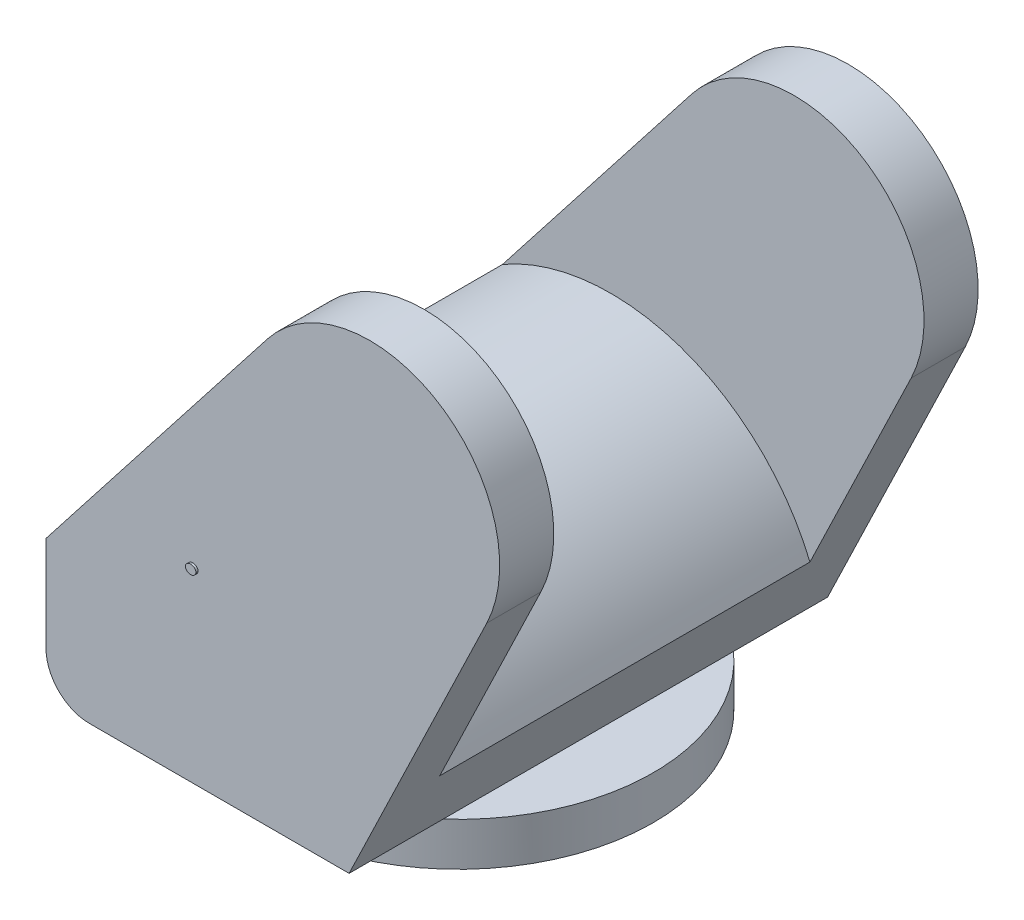
ISO-10303-21;
HEADER;
FILE_DESCRIPTION(('STEP AP214'),'2;1');
FILE_NAME('part.step','',(''),(''),'','','');
FILE_SCHEMA(('AUTOMOTIVE_DESIGN { 1 0 10303 214 1 1 1 1 }'));
ENDSEC;
DATA;
#1=APPLICATION_CONTEXT('core data for automotive mechanical design processes');
#2=APPLICATION_PROTOCOL_DEFINITION('international standard','automotive_design',2000,#1);
#3=PRODUCT_CONTEXT('',#1,'mechanical');
#4=PRODUCT('Part','Part','',(#3));
#5=PRODUCT_RELATED_PRODUCT_CATEGORY('part','',(#4));
#6=PRODUCT_DEFINITION_FORMATION('','',#4);
#7=PRODUCT_DEFINITION_CONTEXT('part definition',#1,'design');
#8=PRODUCT_DEFINITION('design','',#6,#7);
#9=PRODUCT_DEFINITION_SHAPE('','',#8);
#10=(LENGTH_UNIT() NAMED_UNIT(*) SI_UNIT(.MILLI.,.METRE.));
#11=(NAMED_UNIT(*) PLANE_ANGLE_UNIT() SI_UNIT($,.RADIAN.));
#12=(NAMED_UNIT(*) SI_UNIT($,.STERADIAN.) SOLID_ANGLE_UNIT());
#13=UNCERTAINTY_MEASURE_WITH_UNIT(LENGTH_MEASURE(1.E-05),#10,'distance_accuracy_value','');
#14=(GEOMETRIC_REPRESENTATION_CONTEXT(3) GLOBAL_UNCERTAINTY_ASSIGNED_CONTEXT((#13)) GLOBAL_UNIT_ASSIGNED_CONTEXT((#10,
#11,#12)) REPRESENTATION_CONTEXT('',''));
#15=CARTESIAN_POINT('',(0.,0.,0.));
#16=DIRECTION('',(0.,0.,1.));
#17=DIRECTION('',(1.,0.,0.));
#18=AXIS2_PLACEMENT_3D('',#15,#16,#17);
#19=CARTESIAN_POINT('',(-9.54614839573771,-157.96,110.5));
#20=DIRECTION('',(0.,-1.,0.));
#21=DIRECTION('',(-1.,0.,0.));
#22=AXIS2_PLACEMENT_3D('',#19,#20,#21);
#23=PLANE('',#22);
#24=DIRECTION('',(0.,0.,-1.));
#25=VECTOR('',#24,1.);
#26=CARTESIAN_POINT('',(-129.546148395738,-157.96,110.5));
#27=LINE('',#26,#25);
#28=CARTESIAN_POINT('',(-129.546148395738,-157.96,110.5));
#29=VERTEX_POINT('',#28);
#30=CARTESIAN_POINT('',(-129.546148395738,-157.96,67.0820393249939));
#31=VERTEX_POINT('',#30);
#32=EDGE_CURVE('E257',#29,#31,#27,.T.);
#33=ORIENTED_EDGE('',*,*,#32,.T.);
#34=CARTESIAN_POINT('',(-69.5461483957381,-157.96,0.));
#35=DIRECTION('',(0.,-1.,0.));
#36=DIRECTION('',(-1.,0.,0.));
#37=AXIS2_PLACEMENT_3D('',#34,#35,#36);
#38=CIRCLE('',#37,90.);
#39=CARTESIAN_POINT('',(-9.54614839573785,-157.96,67.0820393249935));
#40=VERTEX_POINT('',#39);
#41=EDGE_CURVE('E11',#31,#40,#38,.F.);
#42=ORIENTED_EDGE('',*,*,#41,.T.);
#43=DIRECTION('',(0.,0.,-1.));
#44=VECTOR('',#43,1.);
#45=CARTESIAN_POINT('',(-9.54614839573771,-157.96,110.5));
#46=LINE('',#45,#44);
#47=CARTESIAN_POINT('',(-9.54614839573771,-157.96,110.5));
#48=VERTEX_POINT('',#47);
#49=EDGE_CURVE('E270',#48,#40,#46,.T.);
#50=ORIENTED_EDGE('',*,*,#49,.F.);
#51=DIRECTION('',(-1.,0.,0.));
#52=VECTOR('',#51,1.);
#53=CARTESIAN_POINT('',(-9.54614839573771,-157.96,110.5));
#54=LINE('',#53,#52);
#55=EDGE_CURVE('E260',#48,#29,#54,.T.);
#56=ORIENTED_EDGE('',*,*,#55,.T.);
#57=EDGE_LOOP('',(#33,#42,#50,#56));
#58=FACE_BOUND('',#57,.T.);
#59=ADVANCED_FACE('F35',(#58),#23,.T.);
#60=CARTESIAN_POINT('',(0.,0.,110.5));
#61=DIRECTION('',(0.,0.,-1.));
#62=DIRECTION('',(-1.,0.,0.));
#63=AXIS2_PLACEMENT_3D('',#60,#61,#62);
#64=CYLINDRICAL_SURFACE('',#63,60.);
#65=DIRECTION('',(0.,0.,-1.));
#66=VECTOR('',#65,1.);
#67=CARTESIAN_POINT('',(54.0466596870904,-26.0568335886737,110.5));
#68=LINE('',#67,#66);
#69=CARTESIAN_POINT('',(54.0466596870904,-26.0568335886737,110.5));
#70=VERTEX_POINT('',#69);
#71=CARTESIAN_POINT('',(54.0466596870904,-26.0568335886737,85.4999999999996));
#72=VERTEX_POINT('',#71);
#73=EDGE_CURVE('E43',#70,#72,#68,.T.);
#74=ORIENTED_EDGE('',*,*,#73,.T.);
#75=CARTESIAN_POINT('',(0.,0.,85.4999999999997));
#76=DIRECTION('',(0.,0.,-1.));
#77=DIRECTION('',(-1.,0.,0.));
#78=AXIS2_PLACEMENT_3D('',#75,#76,#77);
#79=CIRCLE('',#78,60.);
#80=CARTESIAN_POINT('',(-47.2814411313745,36.9386697722099,85.4999999999999));
#81=VERTEX_POINT('',#80);
#82=EDGE_CURVE('E356',#81,#72,#79,.T.);
#83=ORIENTED_EDGE('',*,*,#82,.F.);
#84=DIRECTION('',(0.,0.,-1.));
#85=VECTOR('',#84,1.);
#86=CARTESIAN_POINT('',(-47.2814411313744,36.9386697722099,110.5));
#87=LINE('',#86,#85);
#88=CARTESIAN_POINT('',(-47.2814411313744,36.9386697722099,110.5));
#89=VERTEX_POINT('',#88);
#90=EDGE_CURVE('E294',#89,#81,#87,.T.);
#91=ORIENTED_EDGE('',*,*,#90,.F.);
#92=CARTESIAN_POINT('',(0.,0.,110.5));
#93=DIRECTION('',(0.,0.,-1.));
#94=DIRECTION('',(-1.,0.,0.));
#95=AXIS2_PLACEMENT_3D('',#92,#93,#94);
#96=CIRCLE('',#95,60.);
#97=EDGE_CURVE('E280',#89,#70,#96,.T.);
#98=ORIENTED_EDGE('',*,*,#97,.T.);
#99=EDGE_LOOP('',(#74,#83,#91,#98));
#100=FACE_BOUND('',#99,.T.);
#101=ADVANCED_FACE('F233',(#100),#64,.T.);
#102=CARTESIAN_POINT('',(-9.54614839573771,-157.96,110.5));
#103=DIRECTION('',(0.900777661451507,-0.434280559811229,0.));
#104=DIRECTION('',(-0.434280559811229,-0.900777661451507,0.));
#105=AXIS2_PLACEMENT_3D('',#102,#103,#104);
#106=PLANE('',#105);
#107=DIRECTION('',(-0.434280559811229,-0.900777661451507,0.));
#108=VECTOR('',#107,1.);
#109=CARTESIAN_POINT('',(54.0466596870897,-26.0568335886737,-85.5000000000005));
#110=LINE('',#109,#108);
#111=CARTESIAN_POINT('',(54.0466596870897,-26.0568335886737,-85.5000000000005));
#112=VERTEX_POINT('',#111);
#113=CARTESIAN_POINT('',(7.31079646171123,-122.99559962594,-85.5000000000003));
#114=VERTEX_POINT('',#113);
#115=EDGE_CURVE('E345',#112,#114,#110,.T.);
#116=ORIENTED_EDGE('',*,*,#115,.T.);
#117=DIRECTION('',(0.,0.,1.));
#118=VECTOR('',#117,1.);
#119=CARTESIAN_POINT('',(7.31079646171123,-122.99559962594,-85.5000000000003));
#120=LINE('',#119,#118);
#121=CARTESIAN_POINT('',(7.31079646171184,-122.99559962594,85.4999999999997));
#122=VERTEX_POINT('',#121);
#123=EDGE_CURVE('E336',#114,#122,#120,.T.);
#124=ORIENTED_EDGE('',*,*,#123,.T.);
#125=DIRECTION('',(-0.434280559811229,-0.900777661451507,0.));
#126=VECTOR('',#125,1.);
#127=CARTESIAN_POINT('',(54.0466596870904,-26.0568335886737,85.4999999999996));
#128=LINE('',#127,#126);
#129=EDGE_CURVE('E353',#72,#122,#128,.T.);
#130=ORIENTED_EDGE('',*,*,#129,.F.);
#131=ORIENTED_EDGE('',*,*,#73,.F.);
#132=DIRECTION('',(-0.434280559811229,-0.900777661451507,0.));
#133=VECTOR('',#132,1.);
#134=CARTESIAN_POINT('',(-9.54614839573771,-157.96,110.5));
#135=LINE('',#134,#133);
#136=EDGE_CURVE('E317',#70,#48,#135,.T.);
#137=ORIENTED_EDGE('',*,*,#136,.T.);
#138=ORIENTED_EDGE('',*,*,#49,.T.);
#139=CARTESIAN_POINT('',(-9.54614839573832,-157.96,-67.0820393249939));
#140=VERTEX_POINT('',#139);
#141=EDGE_CURVE('E275',#40,#140,#46,.T.);
#142=ORIENTED_EDGE('',*,*,#141,.T.);
#143=CARTESIAN_POINT('',(-9.54614839573849,-157.96,-110.5));
#144=VERTEX_POINT('',#143);
#145=EDGE_CURVE('E276',#140,#144,#46,.T.);
#146=ORIENTED_EDGE('',*,*,#145,.T.);
#147=DIRECTION('',(-0.434280559811229,-0.900777661451507,0.));
#148=VECTOR('',#147,1.);
#149=CARTESIAN_POINT('',(-9.54614839573849,-157.96,-110.5));
#150=LINE('',#149,#148);
#151=CARTESIAN_POINT('',(54.0466596870897,-26.0568335886737,-110.5));
#152=VERTEX_POINT('',#151);
#153=EDGE_CURVE('E334',#152,#144,#150,.T.);
#154=ORIENTED_EDGE('',*,*,#153,.F.);
#155=EDGE_CURVE('E293',#112,#152,#68,.T.);
#156=ORIENTED_EDGE('',*,*,#155,.F.);
#157=EDGE_LOOP('',(#116,#124,#130,#131,#137,#138,#142,#146,#154,#156));
#158=FACE_BOUND('',#157,.T.);
#159=ADVANCED_FACE('F37',(#158),#106,.T.);
#160=CARTESIAN_POINT('',(-6.93889390390723E-13,0.,-85.5000000000003));
#161=DIRECTION('',(0.,0.,-1.));
#162=DIRECTION('',(-1.,0.,0.));
#163=AXIS2_PLACEMENT_3D('',#160,#161,#162);
#164=CIRCLE('',#163,60.);
#165=CARTESIAN_POINT('',(-47.2814411313751,36.9386697722099,-85.5000000000001));
#166=VERTEX_POINT('',#165);
#167=EDGE_CURVE('E348',#166,#112,#164,.T.);
#168=ORIENTED_EDGE('',*,*,#167,.T.);
#169=ORIENTED_EDGE('',*,*,#155,.T.);
#170=CARTESIAN_POINT('',(-7.7715611723761E-13,0.,-110.5));
#171=DIRECTION('',(0.,0.,-1.));
#172=DIRECTION('',(-1.,0.,0.));
#173=AXIS2_PLACEMENT_3D('',#170,#171,#172);
#174=CIRCLE('',#173,60.);
#175=CARTESIAN_POINT('',(-47.2814411313752,36.9386697722099,-110.5));
#176=VERTEX_POINT('',#175);
#177=EDGE_CURVE('E312',#176,#152,#174,.T.);
#178=ORIENTED_EDGE('',*,*,#177,.F.);
#179=EDGE_CURVE('E297',#166,#176,#87,.T.);
#180=ORIENTED_EDGE('',*,*,#179,.F.);
#181=EDGE_LOOP('',(#168,#169,#178,#180));
#182=FACE_BOUND('',#181,.T.);
#183=ADVANCED_FACE('F228',(#182),#64,.T.);
#184=CARTESIAN_POINT('',(-149.546148395738,-93.96,110.5));
#185=DIRECTION('',(-0.78802401885624,0.6156444962035,0.));
#186=DIRECTION('',(0.6156444962035,0.78802401885624,0.));
#187=AXIS2_PLACEMENT_3D('',#184,#185,#186);
#188=PLANE('',#187);
#189=DIRECTION('',(0.6156444962035,0.78802401885624,0.));
#190=VECTOR('',#189,1.);
#191=CARTESIAN_POINT('',(-134.696631243722,-74.9526406288566,-85.4999999999998));
#192=LINE('',#191,#190);
#193=CARTESIAN_POINT('',(-134.696631243722,-74.9526406288566,-85.4999999999998));
#194=VERTEX_POINT('',#193);
#195=EDGE_CURVE('E307',#194,#166,#192,.T.);
#196=ORIENTED_EDGE('',*,*,#195,.T.);
#197=ORIENTED_EDGE('',*,*,#179,.T.);
#198=DIRECTION('',(0.6156444962035,0.78802401885624,0.));
#199=VECTOR('',#198,1.);
#200=CARTESIAN_POINT('',(-149.546148395738,-93.96,-110.5));
#201=LINE('',#200,#199);
#202=CARTESIAN_POINT('',(-149.546148395738,-93.96,-110.5));
#203=VERTEX_POINT('',#202);
#204=EDGE_CURVE('E305',#203,#176,#201,.T.);
#205=ORIENTED_EDGE('',*,*,#204,.F.);
#206=DIRECTION('',(0.,0.,-1.));
#207=VECTOR('',#206,1.);
#208=CARTESIAN_POINT('',(-149.546148395738,-93.96,110.5));
#209=LINE('',#208,#207);
#210=CARTESIAN_POINT('',(-149.546148395738,-93.96,110.5));
#211=VERTEX_POINT('',#210);
#212=EDGE_CURVE('E268',#211,#203,#209,.T.);
#213=ORIENTED_EDGE('',*,*,#212,.F.);
#214=DIRECTION('',(0.6156444962035,0.78802401885624,0.));
#215=VECTOR('',#214,1.);
#216=CARTESIAN_POINT('',(-149.546148395738,-93.96,110.5));
#217=LINE('',#216,#215);
#218=EDGE_CURVE('E283',#211,#89,#217,.T.);
#219=ORIENTED_EDGE('',*,*,#218,.T.);
#220=ORIENTED_EDGE('',*,*,#90,.T.);
#221=DIRECTION('',(0.6156444962035,0.78802401885624,0.));
#222=VECTOR('',#221,1.);
#223=CARTESIAN_POINT('',(-134.696631243722,-74.9526406288566,85.5000000000002));
#224=LINE('',#223,#222);
#225=CARTESIAN_POINT('',(-134.696631243722,-74.9526406288566,85.5000000000002));
#226=VERTEX_POINT('',#225);
#227=EDGE_CURVE('E358',#226,#81,#224,.T.);
#228=ORIENTED_EDGE('',*,*,#227,.F.);
#229=DIRECTION('',(0.,0.,1.));
#230=VECTOR('',#229,1.);
#231=CARTESIAN_POINT('',(-134.696631243722,-74.9526406288566,-85.4999999999998));
#232=LINE('',#231,#230);
#233=EDGE_CURVE('E339',#194,#226,#232,.T.);
#234=ORIENTED_EDGE('',*,*,#233,.F.);
#235=EDGE_LOOP('',(#196,#197,#205,#213,#219,#220,#228,#234));
#236=FACE_BOUND('',#235,.T.);
#237=ADVANCED_FACE('F231',(#236),#188,.T.);
#238=CARTESIAN_POINT('',(-149.546148395738,-137.96,110.5));
#239=DIRECTION('',(-1.,0.,0.));
#240=DIRECTION('',(0.,0.,1.));
#241=AXIS2_PLACEMENT_3D('',#238,#239,#240);
#242=PLANE('',#241);
#243=ORIENTED_EDGE('',*,*,#212,.T.);
#244=DIRECTION('',(0.,1.,0.));
#245=VECTOR('',#244,1.);
#246=CARTESIAN_POINT('',(-149.546148395738,-137.96,-110.5));
#247=LINE('',#246,#245);
#248=CARTESIAN_POINT('',(-149.546148395738,-137.96,-110.5));
#249=VERTEX_POINT('',#248);
#250=EDGE_CURVE('E314',#249,#203,#247,.T.);
#251=ORIENTED_EDGE('',*,*,#250,.F.);
#252=DIRECTION('',(0.,0.,-1.));
#253=VECTOR('',#252,1.);
#254=CARTESIAN_POINT('',(-149.546148395738,-137.96,110.5));
#255=LINE('',#254,#253);
#256=CARTESIAN_POINT('',(-149.546148395738,-137.96,110.5));
#257=VERTEX_POINT('',#256);
#258=EDGE_CURVE('E264',#257,#249,#255,.T.);
#259=ORIENTED_EDGE('',*,*,#258,.F.);
#260=DIRECTION('',(0.,1.,0.));
#261=VECTOR('',#260,1.);
#262=CARTESIAN_POINT('',(-149.546148395738,-137.96,110.5));
#263=LINE('',#262,#261);
#264=EDGE_CURVE('E288',#257,#211,#263,.T.);
#265=ORIENTED_EDGE('',*,*,#264,.T.);
#266=EDGE_LOOP('',(#243,#251,#259,#265));
#267=FACE_BOUND('',#266,.T.);
#268=ADVANCED_FACE('F236',(#267),#242,.T.);
#269=CARTESIAN_POINT('',(-129.546148395738,-137.96,110.5));
#270=DIRECTION('',(0.,0.,-1.));
#271=DIRECTION('',(-1.,0.,0.));
#272=AXIS2_PLACEMENT_3D('',#269,#270,#271);
#273=CYLINDRICAL_SURFACE('',#272,20.);
#274=ORIENTED_EDGE('',*,*,#258,.T.);
#275=CARTESIAN_POINT('',(-129.546148395738,-137.96,-110.5));
#276=DIRECTION('',(0.,0.,-1.));
#277=DIRECTION('',(1.,0.,0.));
#278=AXIS2_PLACEMENT_3D('',#275,#276,#277);
#279=CIRCLE('',#278,20.);
#280=CARTESIAN_POINT('',(-129.546148395738,-157.96,-110.5));
#281=VERTEX_POINT('',#280);
#282=EDGE_CURVE('E329',#281,#249,#279,.T.);
#283=ORIENTED_EDGE('',*,*,#282,.F.);
#284=CARTESIAN_POINT('',(-129.546148395738,-157.96,-67.0820393249935));
#285=VERTEX_POINT('',#284);
#286=EDGE_CURVE('E267',#285,#281,#27,.T.);
#287=ORIENTED_EDGE('',*,*,#286,.F.);
#288=EDGE_CURVE('E265',#31,#285,#27,.T.);
#289=ORIENTED_EDGE('',*,*,#288,.F.);
#290=ORIENTED_EDGE('',*,*,#32,.F.);
#291=CARTESIAN_POINT('',(-129.546148395738,-137.96,110.5));
#292=DIRECTION('',(0.,0.,-1.));
#293=DIRECTION('',(1.,0.,0.));
#294=AXIS2_PLACEMENT_3D('',#291,#292,#293);
#295=CIRCLE('',#294,20.);
#296=EDGE_CURVE('E323',#29,#257,#295,.T.);
#297=ORIENTED_EDGE('',*,*,#296,.T.);
#298=EDGE_LOOP('',(#274,#283,#287,#289,#290,#297));
#299=FACE_BOUND('',#298,.T.);
#300=ADVANCED_FACE('F240',(#299),#273,.T.);
#301=ORIENTED_EDGE('',*,*,#145,.F.);
#302=CARTESIAN_POINT('',(-69.5461483957381,-157.96,0.));
#303=DIRECTION('',(0.,-1.,0.));
#304=DIRECTION('',(-1.,0.,0.));
#305=AXIS2_PLACEMENT_3D('',#302,#303,#304);
#306=CIRCLE('',#305,90.);
#307=EDGE_CURVE('E361',#285,#140,#306,.T.);
#308=ORIENTED_EDGE('',*,*,#307,.F.);
#309=ORIENTED_EDGE('',*,*,#286,.T.);
#310=DIRECTION('',(-1.,0.,0.));
#311=VECTOR('',#310,1.);
#312=CARTESIAN_POINT('',(-9.54614839573849,-157.96,-110.5));
#313=LINE('',#312,#311);
#314=EDGE_CURVE('E330',#144,#281,#313,.T.);
#315=ORIENTED_EDGE('',*,*,#314,.F.);
#316=EDGE_LOOP('',(#301,#308,#309,#315));
#317=FACE_BOUND('',#316,.T.);
#318=ADVANCED_FACE('F226',(#317),#23,.T.);
#319=CARTESIAN_POINT('',(0.,0.,110.5));
#320=DIRECTION('',(0.,0.,-1.));
#321=DIRECTION('',(-1.,0.,0.));
#322=AXIS2_PLACEMENT_3D('',#319,#320,#321);
#323=PLANE('',#322);
#324=CARTESIAN_POINT('',(-81.7313105618894,-74.0306365935485,110.5));
#325=CARTESIAN_POINT('',(-81.8923514179036,-74.0232131292476,110.5));
#326=CARTESIAN_POINT('',(-82.2054447841983,-74.0087805344077,110.5));
#327=CARTESIAN_POINT('',(-82.6564349238857,-73.8876702281738,110.5));
#328=CARTESIAN_POINT('',(-83.0713954931901,-73.6970645678252,110.5));
#329=CARTESIAN_POINT('',(-83.4417071138618,-73.4330333031447,110.5));
#330=CARTESIAN_POINT('',(-83.7429105397164,-73.1105669667188,110.5));
#331=CARTESIAN_POINT('',(-83.9738897274158,-72.75352829492,110.5));
#332=CARTESIAN_POINT('',(-84.1083739298402,-72.3587997331823,110.5));
#333=CARTESIAN_POINT('',(-84.1261848452545,-72.0851490046161,110.5));
#334=CARTESIAN_POINT('',(-84.1351567157356,-71.9473032602152,110.5));
#335=B_SPLINE_CURVE_WITH_KNOTS('',3,(#324,#325,#326,#327,#328,#329,#330,#331,#332,#333,#334),
.UNSPECIFIED.,.F.,.F.,(4,1,1,1,1,1,1,1,4),(0.,0.136783497817496,0.265932551808333,
0.394259415936111,0.523502101442865,0.650073039129526,0.767471051535779,0.88286847923349,1.),.UNSPECIFIED.);
#336=CARTESIAN_POINT('',(-81.7313105618894,-74.0306365935485,110.5));
#337=VERTEX_POINT('',#336);
#338=CARTESIAN_POINT('',(-84.1351567157356,-71.9473032602152,110.5));
#339=VERTEX_POINT('',#338);
#340=EDGE_CURVE('E174',#337,#339,#335,.T.);
#341=ORIENTED_EDGE('',*,*,#340,.T.);
#342=CARTESIAN_POINT('',(-84.1351567157356,-71.9473032602152,110.5));
#343=CARTESIAN_POINT('',(-84.1265171379849,-71.806056124457,110.5));
#344=CARTESIAN_POINT('',(-84.1095662196374,-71.5289281519878,110.5));
#345=CARTESIAN_POINT('',(-83.9736513117478,-71.131266879974,110.5));
#346=CARTESIAN_POINT('',(-83.7444652678207,-70.7742359298858,110.5));
#347=CARTESIAN_POINT('',(-83.4398455703518,-70.4565795114849,110.5));
#348=CARTESIAN_POINT('',(-83.0715200599566,-70.1927629616667,110.5));
#349=CARTESIAN_POINT('',(-82.6571807042503,-70.0004746932185,110.5));
#350=CARTESIAN_POINT('',(-82.2046158023818,-69.8874727508356,110.5));
#351=CARTESIAN_POINT('',(-81.8922103789756,-69.8719596970167,110.5));
#352=CARTESIAN_POINT('',(-81.7313105618894,-69.8639699268818,110.5));
#353=B_SPLINE_CURVE_WITH_KNOTS('',3,(#342,#343,#344,#345,#346,#347,#348,#349,#350,#351,#352),
.UNSPECIFIED.,.F.,.F.,(4,1,1,1,1,1,1,1,4),(0.,0.119782305061424,0.235013808678008,
0.352243020464322,0.477601834232647,0.606658688267567,0.734801037736402,0.863413176204114,1.),.UNSPECIFIED.);
#354=CARTESIAN_POINT('',(-81.7313105618894,-69.8639699268818,110.5));
#355=VERTEX_POINT('',#354);
#356=EDGE_CURVE('E384',#339,#355,#353,.T.);
#357=ORIENTED_EDGE('',*,*,#356,.T.);
#358=CARTESIAN_POINT('',(-81.7313105618894,-69.8639699268818,110.5));
#359=CARTESIAN_POINT('',(-81.5704371376039,-69.8720252700977,110.5));
#360=CARTESIAN_POINT('',(-81.2580829588431,-69.8876656415637,110.5));
#361=CARTESIAN_POINT('',(-80.8066310653148,-69.9993902766501,110.5));
#362=CARTESIAN_POINT('',(-80.3948852008152,-70.194012929239,110.5));
#363=CARTESIAN_POINT('',(-80.0277986165649,-70.4580921542958,110.5));
#364=CARTESIAN_POINT('',(-79.7179743690737,-70.7724942095294,110.5));
#365=CARTESIAN_POINT('',(-79.4891748791891,-71.1314594903476,110.5));
#366=CARTESIAN_POINT('',(-79.3530016518903,-71.5288781345394,110.5));
#367=CARTESIAN_POINT('',(-79.3360860073631,-71.8060392381242,110.5));
#368=CARTESIAN_POINT('',(-79.3274644080433,-71.9473032602152,110.5));
#369=B_SPLINE_CURVE_WITH_KNOTS('',3,(#358,#359,#360,#361,#362,#363,#364,#365,#366,#367,#368),
.UNSPECIFIED.,.F.,.F.,(4,1,1,1,1,1,1,1,4),(0.,0.136628172386256,0.265279245287629,
0.392174954997242,0.521270878093463,0.647650345879818,0.764915046174634,0.88018143353848,1.),.UNSPECIFIED.);
#370=CARTESIAN_POINT('',(-79.3274644080433,-71.9473032602152,110.5));
#371=VERTEX_POINT('',#370);
#372=EDGE_CURVE('E154',#355,#371,#369,.T.);
#373=ORIENTED_EDGE('',*,*,#372,.T.);
#374=CARTESIAN_POINT('',(-79.3274644080433,-71.9473032602152,110.5));
#375=CARTESIAN_POINT('',(-79.3364187744759,-72.0851651661321,110.5));
#376=CARTESIAN_POINT('',(-79.354194940935,-72.3588479784646,110.5));
#377=CARTESIAN_POINT('',(-79.4889382849657,-72.7533372743407,110.5));
#378=CARTESIAN_POINT('',(-79.7195176188994,-73.1122937954351,110.5));
#379=CARTESIAN_POINT('',(-80.0259501095237,-73.4315357400569,110.5));
#380=CARTESIAN_POINT('',(-80.3950059848386,-73.6958129320619,110.5));
#381=CARTESIAN_POINT('',(-80.8073719267804,-73.8887757805523,110.5));
#382=CARTESIAN_POINT('',(-81.2572534030731,-74.0085893857359,110.5));
#383=CARTESIAN_POINT('',(-81.5702958806803,-74.0231482051306,110.5));
#384=CARTESIAN_POINT('',(-81.7313105618894,-74.0306365935485,110.5));
#385=B_SPLINE_CURVE_WITH_KNOTS('',3,(#374,#375,#376,#377,#378,#379,#380,#381,#382,#383,#384),
.UNSPECIFIED.,.F.,.F.,(4,1,1,1,1,1,1,1,4),(0.,0.117167963368276,0.232601294147196,
0.350035832067557,0.477622317410025,0.606905213610606,0.733984709796241,0.863173945349753,1.),.UNSPECIFIED.);
#386=EDGE_CURVE('E50',#371,#337,#385,.T.);
#387=ORIENTED_EDGE('',*,*,#386,.T.);
#388=EDGE_LOOP('',(#341,#357,#373,#387));
#389=FACE_BOUND('',#388,.T.);
#390=ORIENTED_EDGE('',*,*,#136,.F.);
#391=ORIENTED_EDGE('',*,*,#97,.F.);
#392=ORIENTED_EDGE('',*,*,#218,.F.);
#393=ORIENTED_EDGE('',*,*,#264,.F.);
#394=ORIENTED_EDGE('',*,*,#296,.F.);
#395=ORIENTED_EDGE('',*,*,#55,.F.);
#396=EDGE_LOOP('',(#390,#391,#392,#393,#394,#395));
#397=FACE_BOUND('',#396,.T.);
#398=ADVANCED_FACE('F222',(#389,#397),#323,.F.);
#399=CARTESIAN_POINT('',(-7.7715611723761E-13,0.,-110.5));
#400=DIRECTION('',(0.,0.,-1.));
#401=DIRECTION('',(-1.,0.,0.));
#402=AXIS2_PLACEMENT_3D('',#399,#400,#401);
#403=PLANE('',#402);
#404=ORIENTED_EDGE('',*,*,#153,.T.);
#405=ORIENTED_EDGE('',*,*,#314,.T.);
#406=ORIENTED_EDGE('',*,*,#282,.T.);
#407=ORIENTED_EDGE('',*,*,#250,.T.);
#408=ORIENTED_EDGE('',*,*,#204,.T.);
#409=ORIENTED_EDGE('',*,*,#177,.T.);
#410=EDGE_LOOP('',(#404,#405,#406,#407,#408,#409));
#411=FACE_BOUND('',#410,.T.);
#412=ADVANCED_FACE('F218',(#411),#403,.T.);
#413=CARTESIAN_POINT('',(-84.6846991746112,-161.022524228082,-85.5));
#414=DIRECTION('',(0.,0.,1.));
#415=DIRECTION('',(1.,0.,0.));
#416=AXIS2_PLACEMENT_3D('',#413,#414,#415);
#417=CYLINDRICAL_SURFACE('',#416,99.545056191001);
#418=ORIENTED_EDGE('',*,*,#123,.F.);
#419=CARTESIAN_POINT('',(-84.6846991746112,-161.022524228082,-85.5));
#420=DIRECTION('',(0.,0.,-1.));
#421=DIRECTION('',(-1.,0.,0.));
#422=AXIS2_PLACEMENT_3D('',#419,#420,#421);
#423=CIRCLE('',#422,99.545056191001);
#424=EDGE_CURVE('E342',#194,#114,#423,.T.);
#425=ORIENTED_EDGE('',*,*,#424,.F.);
#426=ORIENTED_EDGE('',*,*,#233,.T.);
#427=CARTESIAN_POINT('',(-84.6846991746106,-161.022524228082,85.5));
#428=DIRECTION('',(0.,0.,-1.));
#429=DIRECTION('',(-1.,0.,0.));
#430=AXIS2_PLACEMENT_3D('',#427,#428,#429);
#431=CIRCLE('',#430,99.545056191001);
#432=EDGE_CURVE('E351',#226,#122,#431,.T.);
#433=ORIENTED_EDGE('',*,*,#432,.T.);
#434=EDGE_LOOP('',(#418,#425,#426,#433));
#435=FACE_BOUND('',#434,.T.);
#436=ADVANCED_FACE('F214',(#435),#417,.T.);
#437=CARTESIAN_POINT('',(-6.93889390390723E-13,0.,-85.5000000000003));
#438=DIRECTION('',(0.,0.,-1.));
#439=DIRECTION('',(-1.,0.,0.));
#440=AXIS2_PLACEMENT_3D('',#437,#438,#439);
#441=PLANE('',#440);
#442=ORIENTED_EDGE('',*,*,#195,.F.);
#443=ORIENTED_EDGE('',*,*,#424,.T.);
#444=ORIENTED_EDGE('',*,*,#115,.F.);
#445=ORIENTED_EDGE('',*,*,#167,.F.);
#446=EDGE_LOOP('',(#442,#443,#444,#445));
#447=FACE_BOUND('',#446,.T.);
#448=ADVANCED_FACE('F210',(#447),#441,.F.);
#449=CARTESIAN_POINT('',(0.,0.,85.4999999999997));
#450=DIRECTION('',(0.,0.,-1.));
#451=DIRECTION('',(-1.,0.,0.));
#452=AXIS2_PLACEMENT_3D('',#449,#450,#451);
#453=PLANE('',#452);
#454=ORIENTED_EDGE('',*,*,#227,.T.);
#455=ORIENTED_EDGE('',*,*,#82,.T.);
#456=ORIENTED_EDGE('',*,*,#129,.T.);
#457=ORIENTED_EDGE('',*,*,#432,.F.);
#458=EDGE_LOOP('',(#454,#455,#456,#457));
#459=FACE_BOUND('',#458,.T.);
#460=ADVANCED_FACE('F207',(#459),#453,.T.);
#461=CARTESIAN_POINT('',(-69.5461483957381,-157.96,0.));
#462=DIRECTION('',(0.,-1.,0.));
#463=DIRECTION('',(-1.,0.,0.));
#464=AXIS2_PLACEMENT_3D('',#461,#462,#463);
#465=PLANE('',#464);
#466=ORIENTED_EDGE('',*,*,#141,.F.);
#467=EDGE_CURVE('E363',#140,#40,#306,.T.);
#468=ORIENTED_EDGE('',*,*,#467,.F.);
#469=EDGE_LOOP('',(#466,#468));
#470=FACE_BOUND('',#469,.T.);
#471=ADVANCED_FACE('F203',(#470),#465,.F.);
#472=CARTESIAN_POINT('',(-69.5461483957381,-177.96,0.));
#473=DIRECTION('',(0.,1.,0.));
#474=DIRECTION('',(1.,0.,0.));
#475=AXIS2_PLACEMENT_3D('',#472,#473,#474);
#476=CYLINDRICAL_SURFACE('',#475,90.);
#477=CARTESIAN_POINT('',(-69.5461483957381,-177.96,0.));
#478=DIRECTION('',(0.,-1.,0.));
#479=DIRECTION('',(-1.,0.,0.));
#480=AXIS2_PLACEMENT_3D('',#477,#478,#479);
#481=CIRCLE('',#480,90.);
#482=CARTESIAN_POINT('',(-159.546148395738,-177.96,2.99244866809498E-13));
#483=VERTEX_POINT('',#482);
#484=EDGE_CURVE('E360',#483,#483,#481,.T.);
#485=ORIENTED_EDGE('',*,*,#484,.F.);
#486=EDGE_LOOP('',(#485));
#487=FACE_BOUND('',#486,.T.);
#488=ORIENTED_EDGE('',*,*,#307,.T.);
#489=ORIENTED_EDGE('',*,*,#467,.T.);
#490=ORIENTED_EDGE('',*,*,#41,.F.);
#491=EDGE_CURVE('E58',#31,#285,#306,.T.);
#492=ORIENTED_EDGE('',*,*,#491,.T.);
#493=EDGE_LOOP('',(#488,#489,#490,#492));
#494=FACE_BOUND('',#493,.T.);
#495=ADVANCED_FACE('F198',(#487,#494),#476,.T.);
#496=CARTESIAN_POINT('',(-69.5461483957381,-177.96,0.));
#497=DIRECTION('',(0.,-1.,0.));
#498=DIRECTION('',(-1.,0.,0.));
#499=AXIS2_PLACEMENT_3D('',#496,#497,#498);
#500=PLANE('',#499);
#501=ORIENTED_EDGE('',*,*,#484,.T.);
#502=EDGE_LOOP('',(#501));
#503=FACE_BOUND('',#502,.T.);
#504=ADVANCED_FACE('F195',(#503),#500,.T.);
#505=ORIENTED_EDGE('',*,*,#288,.T.);
#506=ORIENTED_EDGE('',*,*,#491,.F.);
#507=EDGE_LOOP('',(#505,#506));
#508=FACE_BOUND('',#507,.T.);
#509=ADVANCED_FACE('F193',(#508),#465,.F.);
#510=CARTESIAN_POINT('',(-84.1351567157356,-71.9473032602152,111.5));
#511=CARTESIAN_POINT('',(-84.1265171379849,-71.806056124457,111.5));
#512=CARTESIAN_POINT('',(-84.1095662196374,-71.5289281519878,111.5));
#513=CARTESIAN_POINT('',(-83.9736513117478,-71.131266879974,111.5));
#514=CARTESIAN_POINT('',(-83.7444652678207,-70.7742359298858,111.5));
#515=CARTESIAN_POINT('',(-83.4398455703518,-70.4565795114849,111.5));
#516=CARTESIAN_POINT('',(-83.0715200599566,-70.1927629616667,111.5));
#517=CARTESIAN_POINT('',(-82.6571807042503,-70.0004746932185,111.5));
#518=CARTESIAN_POINT('',(-82.2046158023818,-69.8874727508356,111.5));
#519=CARTESIAN_POINT('',(-81.8922103789756,-69.8719596970167,111.5));
#520=CARTESIAN_POINT('',(-81.7313105618894,-69.8639699268818,111.5));
#521=B_SPLINE_CURVE_WITH_KNOTS('',3,(#510,#511,#512,#513,#514,#515,#516,#517,#518,#519,#520),
.UNSPECIFIED.,.F.,.F.,(4,1,1,1,1,1,1,1,4),(0.,0.119782305061424,0.235013808678008,
0.352243020464322,0.477601834232647,0.606658688267567,0.734801037736402,0.863413176204114,1.),.UNSPECIFIED.);
#522=DIRECTION('',(0.,0.,-1.));
#523=VECTOR('',#522,1.);
#524=SURFACE_OF_LINEAR_EXTRUSION('',#521,#523);
#525=ORIENTED_EDGE('',*,*,#356,.F.);
#526=DIRECTION('',(0.,0.,-1.));
#527=VECTOR('',#526,1.);
#528=CARTESIAN_POINT('',(-84.1351567157356,-71.9473032602152,111.5));
#529=LINE('',#528,#527);
#530=CARTESIAN_POINT('',(-84.1351567157356,-71.9473032602152,111.5));
#531=VERTEX_POINT('',#530);
#532=EDGE_CURVE('E173',#531,#339,#529,.T.);
#533=ORIENTED_EDGE('',*,*,#532,.F.);
#534=CARTESIAN_POINT('',(-81.7313105618894,-69.8639699268818,111.5));
#535=VERTEX_POINT('',#534);
#536=EDGE_CURVE('E167',#531,#535,#521,.T.);
#537=ORIENTED_EDGE('',*,*,#536,.T.);
#538=DIRECTION('',(0.,0.,-1.));
#539=VECTOR('',#538,1.);
#540=CARTESIAN_POINT('',(-81.7313105618894,-69.8639699268818,111.5));
#541=LINE('',#540,#539);
#542=EDGE_CURVE('E149',#535,#355,#541,.T.);
#543=ORIENTED_EDGE('',*,*,#542,.T.);
#544=EDGE_LOOP('',(#525,#533,#537,#543));
#545=FACE_BOUND('',#544,.T.);
#546=ADVANCED_FACE('F172',(#545),#524,.T.);
#547=CARTESIAN_POINT('',(-81.7313105618894,-74.0306365935485,111.5));
#548=CARTESIAN_POINT('',(-81.8923514179036,-74.0232131292476,111.5));
#549=CARTESIAN_POINT('',(-82.2054447841983,-74.0087805344077,111.5));
#550=CARTESIAN_POINT('',(-82.6564349238857,-73.8876702281738,111.5));
#551=CARTESIAN_POINT('',(-83.0713954931901,-73.6970645678252,111.5));
#552=CARTESIAN_POINT('',(-83.4417071138618,-73.4330333031447,111.5));
#553=CARTESIAN_POINT('',(-83.7429105397164,-73.1105669667188,111.5));
#554=CARTESIAN_POINT('',(-83.9738897274158,-72.75352829492,111.5));
#555=CARTESIAN_POINT('',(-84.1083739298402,-72.3587997331823,111.5));
#556=CARTESIAN_POINT('',(-84.1261848452545,-72.0851490046161,111.5));
#557=CARTESIAN_POINT('',(-84.1351567157356,-71.9473032602152,111.5));
#558=B_SPLINE_CURVE_WITH_KNOTS('',3,(#547,#548,#549,#550,#551,#552,#553,#554,#555,#556,#557),
.UNSPECIFIED.,.F.,.F.,(4,1,1,1,1,1,1,1,4),(0.,0.136783497817496,0.265932551808333,
0.394259415936111,0.523502101442865,0.650073039129526,0.767471051535779,0.88286847923349,1.),.UNSPECIFIED.);
#559=DIRECTION('',(0.,0.,-1.));
#560=VECTOR('',#559,1.);
#561=SURFACE_OF_LINEAR_EXTRUSION('',#558,#560);
#562=ORIENTED_EDGE('',*,*,#340,.F.);
#563=DIRECTION('',(0.,0.,-1.));
#564=VECTOR('',#563,1.);
#565=CARTESIAN_POINT('',(-81.7313105618894,-74.0306365935485,111.5));
#566=LINE('',#565,#564);
#567=CARTESIAN_POINT('',(-81.7313105618894,-74.0306365935485,111.5));
#568=VERTEX_POINT('',#567);
#569=EDGE_CURVE('E367',#568,#337,#566,.T.);
#570=ORIENTED_EDGE('',*,*,#569,.F.);
#571=EDGE_CURVE('E160',#568,#531,#558,.T.);
#572=ORIENTED_EDGE('',*,*,#571,.T.);
#573=ORIENTED_EDGE('',*,*,#532,.T.);
#574=EDGE_LOOP('',(#562,#570,#572,#573));
#575=FACE_BOUND('',#574,.T.);
#576=ADVANCED_FACE('F192',(#575),#561,.T.);
#577=CARTESIAN_POINT('',(-79.3274644080433,-71.9473032602152,111.5));
#578=CARTESIAN_POINT('',(-79.3364187744759,-72.0851651661321,111.5));
#579=CARTESIAN_POINT('',(-79.354194940935,-72.3588479784646,111.5));
#580=CARTESIAN_POINT('',(-79.4889382849657,-72.7533372743407,111.5));
#581=CARTESIAN_POINT('',(-79.7195176188994,-73.1122937954351,111.5));
#582=CARTESIAN_POINT('',(-80.0259501095237,-73.4315357400569,111.5));
#583=CARTESIAN_POINT('',(-80.3950059848386,-73.6958129320619,111.5));
#584=CARTESIAN_POINT('',(-80.8073719267804,-73.8887757805523,111.5));
#585=CARTESIAN_POINT('',(-81.2572534030731,-74.0085893857359,111.5));
#586=CARTESIAN_POINT('',(-81.5702958806803,-74.0231482051306,111.5));
#587=CARTESIAN_POINT('',(-81.7313105618894,-74.0306365935485,111.5));
#588=B_SPLINE_CURVE_WITH_KNOTS('',3,(#577,#578,#579,#580,#581,#582,#583,#584,#585,#586,#587),
.UNSPECIFIED.,.F.,.F.,(4,1,1,1,1,1,1,1,4),(0.,0.117167963368276,0.232601294147196,
0.350035832067557,0.477622317410025,0.606905213610606,0.733984709796241,0.863173945349753,1.),.UNSPECIFIED.);
#589=DIRECTION('',(0.,0.,-1.));
#590=VECTOR('',#589,1.);
#591=SURFACE_OF_LINEAR_EXTRUSION('',#588,#590);
#592=ORIENTED_EDGE('',*,*,#386,.F.);
#593=DIRECTION('',(0.,0.,-1.));
#594=VECTOR('',#593,1.);
#595=CARTESIAN_POINT('',(-79.3274644080433,-71.9473032602152,111.5));
#596=LINE('',#595,#594);
#597=CARTESIAN_POINT('',(-79.3274644080433,-71.9473032602152,111.5));
#598=VERTEX_POINT('',#597);
#599=EDGE_CURVE('E159',#598,#371,#596,.T.);
#600=ORIENTED_EDGE('',*,*,#599,.F.);
#601=EDGE_CURVE('E170',#598,#568,#588,.T.);
#602=ORIENTED_EDGE('',*,*,#601,.T.);
#603=ORIENTED_EDGE('',*,*,#569,.T.);
#604=EDGE_LOOP('',(#592,#600,#602,#603));
#605=FACE_BOUND('',#604,.T.);
#606=ADVANCED_FACE('F406',(#605),#591,.T.);
#607=CARTESIAN_POINT('',(-81.7313105618894,-69.8639699268818,111.5));
#608=CARTESIAN_POINT('',(-81.5704371376039,-69.8720252700977,111.5));
#609=CARTESIAN_POINT('',(-81.2580829588431,-69.8876656415637,111.5));
#610=CARTESIAN_POINT('',(-80.8066310653148,-69.9993902766501,111.5));
#611=CARTESIAN_POINT('',(-80.3948852008152,-70.194012929239,111.5));
#612=CARTESIAN_POINT('',(-80.0277986165649,-70.4580921542958,111.5));
#613=CARTESIAN_POINT('',(-79.7179743690737,-70.7724942095294,111.5));
#614=CARTESIAN_POINT('',(-79.4891748791891,-71.1314594903476,111.5));
#615=CARTESIAN_POINT('',(-79.3530016518903,-71.5288781345394,111.5));
#616=CARTESIAN_POINT('',(-79.3360860073631,-71.8060392381242,111.5));
#617=CARTESIAN_POINT('',(-79.3274644080433,-71.9473032602152,111.5));
#618=B_SPLINE_CURVE_WITH_KNOTS('',3,(#607,#608,#609,#610,#611,#612,#613,#614,#615,#616,#617),
.UNSPECIFIED.,.F.,.F.,(4,1,1,1,1,1,1,1,4),(0.,0.136628172386256,0.265279245287629,
0.392174954997242,0.521270878093463,0.647650345879818,0.764915046174634,0.88018143353848,1.),.UNSPECIFIED.);
#619=DIRECTION('',(0.,0.,-1.));
#620=VECTOR('',#619,1.);
#621=SURFACE_OF_LINEAR_EXTRUSION('',#618,#620);
#622=ORIENTED_EDGE('',*,*,#372,.F.);
#623=ORIENTED_EDGE('',*,*,#542,.F.);
#624=EDGE_CURVE('E152',#535,#598,#618,.T.);
#625=ORIENTED_EDGE('',*,*,#624,.T.);
#626=ORIENTED_EDGE('',*,*,#599,.T.);
#627=EDGE_LOOP('',(#622,#623,#625,#626));
#628=FACE_BOUND('',#627,.T.);
#629=ADVANCED_FACE('F151',(#628),#621,.T.);
#630=CARTESIAN_POINT('',(-83.3733840132695,-70.4189581774328,111.5));
#631=DIRECTION('',(-1.24362518131688E-13,0.,1.));
#632=DIRECTION('',(1.,0.,1.24362518131688E-13));
#633=AXIS2_PLACEMENT_3D('',#630,#631,#632);
#634=PLANE('',#633);
#635=ORIENTED_EDGE('',*,*,#536,.F.);
#636=ORIENTED_EDGE('',*,*,#571,.F.);
#637=ORIENTED_EDGE('',*,*,#601,.F.);
#638=ORIENTED_EDGE('',*,*,#624,.F.);
#639=EDGE_LOOP('',(#635,#636,#637,#638));
#640=FACE_BOUND('',#639,.T.);
#641=ADVANCED_FACE('F165',(#640),#634,.T.);
#642=CLOSED_SHELL('',(#59,#101,#159,#183,#237,#268,#300,#318,#398,#412,#436,#448,#460,#471,#495,
#504,#509,#546,#576,#606,#629,#641));
#643=MANIFOLD_SOLID_BREP('B2',#642);
#644=ADVANCED_BREP_SHAPE_REPRESENTATION('',(#18,#643),#14);
#645=SHAPE_DEFINITION_REPRESENTATION(#9,#644);
ENDSEC;
END-ISO-10303-21;
